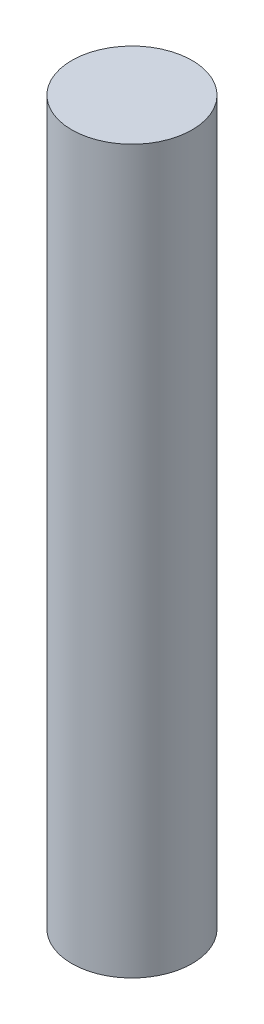
ISO-10303-21;
HEADER;
FILE_DESCRIPTION(('STEP AP214'),'2;1');
FILE_NAME('part.step','',(''),(''),'','','');
FILE_SCHEMA(('AUTOMOTIVE_DESIGN { 1 0 10303 214 1 1 1 1 }'));
ENDSEC;
DATA;
#1=APPLICATION_CONTEXT('core data for automotive mechanical design processes');
#2=APPLICATION_PROTOCOL_DEFINITION('international standard','automotive_design',2000,#1);
#3=PRODUCT_CONTEXT('',#1,'mechanical');
#4=PRODUCT('Part','Part','',(#3));
#5=PRODUCT_RELATED_PRODUCT_CATEGORY('part','',(#4));
#6=PRODUCT_DEFINITION_FORMATION('','',#4);
#7=PRODUCT_DEFINITION_CONTEXT('part definition',#1,'design');
#8=PRODUCT_DEFINITION('design','',#6,#7);
#9=PRODUCT_DEFINITION_SHAPE('','',#8);
#10=(LENGTH_UNIT() NAMED_UNIT(*) SI_UNIT(.MILLI.,.METRE.));
#11=(NAMED_UNIT(*) PLANE_ANGLE_UNIT() SI_UNIT($,.RADIAN.));
#12=(NAMED_UNIT(*) SI_UNIT($,.STERADIAN.) SOLID_ANGLE_UNIT());
#13=UNCERTAINTY_MEASURE_WITH_UNIT(LENGTH_MEASURE(1.E-05),#10,'distance_accuracy_value','');
#14=(GEOMETRIC_REPRESENTATION_CONTEXT(3) GLOBAL_UNCERTAINTY_ASSIGNED_CONTEXT((#13)) GLOBAL_UNIT_ASSIGNED_CONTEXT((#10,
#11,#12)) REPRESENTATION_CONTEXT('',''));
#15=CARTESIAN_POINT('',(0.,0.,0.));
#16=DIRECTION('',(0.,0.,1.));
#17=DIRECTION('',(1.,0.,0.));
#18=AXIS2_PLACEMENT_3D('',#15,#16,#17);
#19=CARTESIAN_POINT('',(0.,24.,0.));
#20=DIRECTION('',(0.,-1.,0.));
#21=DIRECTION('',(0.,0.,-1.));
#22=AXIS2_PLACEMENT_3D('',#19,#20,#21);
#23=CYLINDRICAL_SURFACE('',#22,2.);
#24=CARTESIAN_POINT('',(0.,24.,0.));
#25=DIRECTION('',(0.,1.,0.));
#26=DIRECTION('',(0.,0.,1.));
#27=AXIS2_PLACEMENT_3D('',#24,#25,#26);
#28=CIRCLE('',#27,2.);
#29=CARTESIAN_POINT('',(0.,24.,2.));
#30=VERTEX_POINT('',#29);
#31=EDGE_CURVE('E10',#30,#30,#28,.T.);
#32=ORIENTED_EDGE('',*,*,#31,.F.);
#33=EDGE_LOOP('',(#32));
#34=FACE_BOUND('',#33,.T.);
#35=CARTESIAN_POINT('',(0.,0.,0.));
#36=DIRECTION('',(0.,1.,0.));
#37=DIRECTION('',(0.,0.,1.));
#38=AXIS2_PLACEMENT_3D('',#35,#36,#37);
#39=CIRCLE('',#38,2.);
#40=CARTESIAN_POINT('',(0.,0.,2.));
#41=VERTEX_POINT('',#40);
#42=EDGE_CURVE('E40',#41,#41,#39,.T.);
#43=ORIENTED_EDGE('',*,*,#42,.T.);
#44=EDGE_LOOP('',(#43));
#45=FACE_BOUND('',#44,.T.);
#46=ADVANCED_FACE('F37',(#34,#45),#23,.T.);
#47=CARTESIAN_POINT('',(0.,24.,0.));
#48=DIRECTION('',(0.,1.,0.));
#49=DIRECTION('',(0.,0.,1.));
#50=AXIS2_PLACEMENT_3D('',#47,#48,#49);
#51=PLANE('',#50);
#52=ORIENTED_EDGE('',*,*,#31,.T.);
#53=EDGE_LOOP('',(#52));
#54=FACE_BOUND('',#53,.T.);
#55=ADVANCED_FACE('F54',(#54),#51,.T.);
#56=CARTESIAN_POINT('',(0.,0.,0.));
#57=DIRECTION('',(0.,1.,0.));
#58=DIRECTION('',(0.,0.,1.));
#59=AXIS2_PLACEMENT_3D('',#56,#57,#58);
#60=PLANE('',#59);
#61=ORIENTED_EDGE('',*,*,#42,.F.);
#62=EDGE_LOOP('',(#61));
#63=FACE_BOUND('',#62,.T.);
#64=ADVANCED_FACE('F52',(#63),#60,.F.);
#65=CLOSED_SHELL('',(#46,#55,#64));
#66=MANIFOLD_SOLID_BREP('B2',#65);
#67=ADVANCED_BREP_SHAPE_REPRESENTATION('',(#18,#66),#14);
#68=SHAPE_DEFINITION_REPRESENTATION(#9,#67);
ENDSEC;
END-ISO-10303-21;
